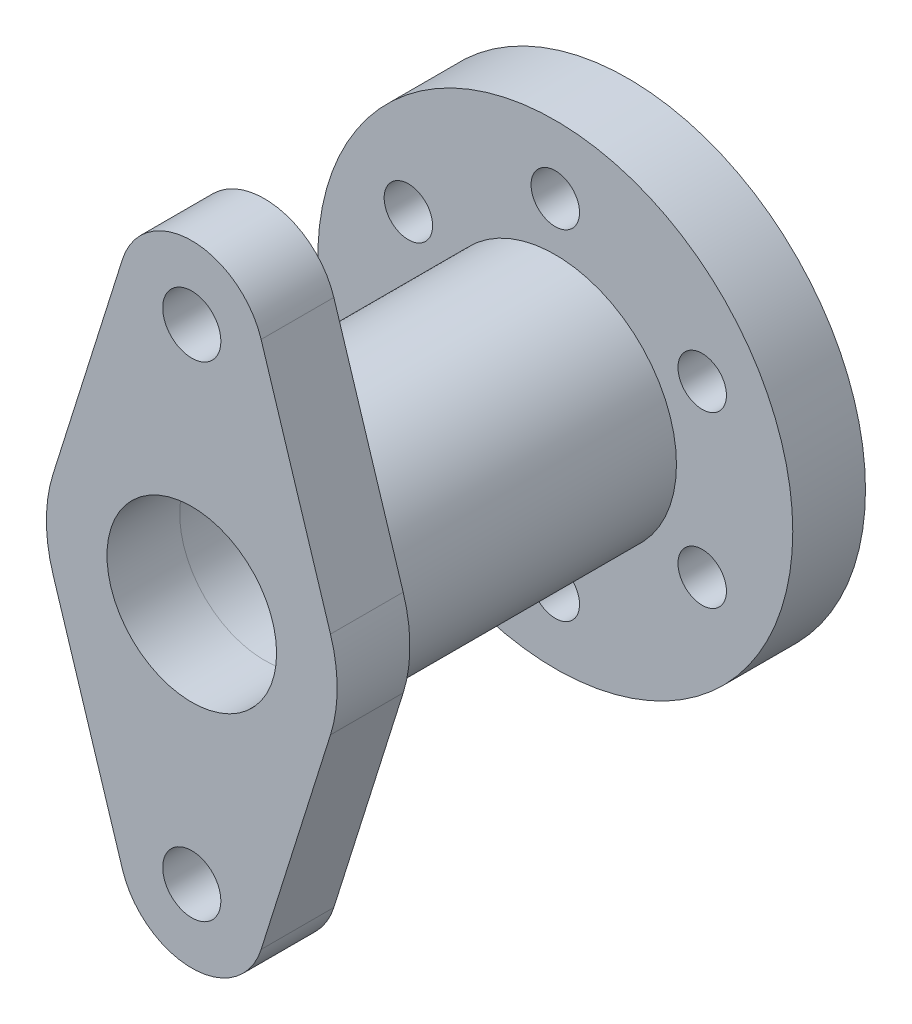
ISO-10303-21;
HEADER;
FILE_DESCRIPTION(('STEP AP214'),'2;1');
FILE_NAME('part.step','',(''),(''),'','','');
FILE_SCHEMA(('AUTOMOTIVE_DESIGN { 1 0 10303 214 1 1 1 1 }'));
ENDSEC;
DATA;
#1=APPLICATION_CONTEXT('core data for automotive mechanical design processes');
#2=APPLICATION_PROTOCOL_DEFINITION('international standard','automotive_design',2000,#1);
#3=PRODUCT_CONTEXT('',#1,'mechanical');
#4=PRODUCT('Part','Part','',(#3));
#5=PRODUCT_RELATED_PRODUCT_CATEGORY('part','',(#4));
#6=PRODUCT_DEFINITION_FORMATION('','',#4);
#7=PRODUCT_DEFINITION_CONTEXT('part definition',#1,'design');
#8=PRODUCT_DEFINITION('design','',#6,#7);
#9=PRODUCT_DEFINITION_SHAPE('','',#8);
#10=(LENGTH_UNIT() NAMED_UNIT(*) SI_UNIT(.MILLI.,.METRE.));
#11=(NAMED_UNIT(*) PLANE_ANGLE_UNIT() SI_UNIT($,.RADIAN.));
#12=(NAMED_UNIT(*) SI_UNIT($,.STERADIAN.) SOLID_ANGLE_UNIT());
#13=UNCERTAINTY_MEASURE_WITH_UNIT(LENGTH_MEASURE(1.E-05),#10,'distance_accuracy_value','');
#14=(GEOMETRIC_REPRESENTATION_CONTEXT(3) GLOBAL_UNCERTAINTY_ASSIGNED_CONTEXT((#13)) GLOBAL_UNIT_ASSIGNED_CONTEXT((#10,
#11,#12)) REPRESENTATION_CONTEXT('',''));
#15=CARTESIAN_POINT('',(0.,0.,0.));
#16=DIRECTION('',(0.,0.,1.));
#17=DIRECTION('',(1.,0.,0.));
#18=AXIS2_PLACEMENT_3D('',#15,#16,#17);
#19=CARTESIAN_POINT('',(28.6181760425084,-9.,75.));
#20=DIRECTION('',(-0.953939201416946,0.3,0.));
#21=DIRECTION('',(-0.3,-0.953939201416946,0.));
#22=AXIS2_PLACEMENT_3D('',#19,#20,#21);
#23=PLANE('',#22);
#24=DIRECTION('',(0.3,0.953939201416946,0.));
#25=VECTOR('',#24,1.);
#26=CARTESIAN_POINT('',(28.6181760425084,-9.,60.));
#27=LINE('',#26,#25);
#28=CARTESIAN_POINT('',(14.3090880212542,-54.5,60.));
#29=VERTEX_POINT('',#28);
#30=CARTESIAN_POINT('',(28.6181760425084,-8.99999999999999,60.));
#31=VERTEX_POINT('',#30);
#32=EDGE_CURVE('E144',#29,#31,#27,.T.);
#33=ORIENTED_EDGE('',*,*,#32,.T.);
#34=DIRECTION('',(0.,0.,-1.));
#35=VECTOR('',#34,1.);
#36=CARTESIAN_POINT('',(28.6181760425084,-8.99999999999999,75.));
#37=LINE('',#36,#35);
#38=CARTESIAN_POINT('',(28.6181760425084,-8.99999999999999,75.));
#39=VERTEX_POINT('',#38);
#40=EDGE_CURVE('E12',#39,#31,#37,.T.);
#41=ORIENTED_EDGE('',*,*,#40,.F.);
#42=DIRECTION('',(0.3,0.953939201416946,0.));
#43=VECTOR('',#42,1.);
#44=CARTESIAN_POINT('',(28.6181760425084,-9.,75.));
#45=LINE('',#44,#43);
#46=CARTESIAN_POINT('',(14.3090880212542,-54.5,75.));
#47=VERTEX_POINT('',#46);
#48=EDGE_CURVE('E167',#47,#39,#45,.T.);
#49=ORIENTED_EDGE('',*,*,#48,.F.);
#50=DIRECTION('',(0.,0.,-1.));
#51=VECTOR('',#50,1.);
#52=CARTESIAN_POINT('',(14.3090880212542,-54.5,75.));
#53=LINE('',#52,#51);
#54=EDGE_CURVE('E143',#47,#29,#53,.T.);
#55=ORIENTED_EDGE('',*,*,#54,.T.);
#56=EDGE_LOOP('',(#33,#41,#49,#55));
#57=FACE_BOUND('',#56,.T.);
#58=ADVANCED_FACE('F41',(#57),#23,.F.);
#59=CARTESIAN_POINT('',(0.,0.,75.));
#60=DIRECTION('',(0.,0.,-1.));
#61=DIRECTION('',(-1.,0.,0.));
#62=AXIS2_PLACEMENT_3D('',#59,#60,#61);
#63=CYLINDRICAL_SURFACE('',#62,30.);
#64=CARTESIAN_POINT('',(0.,0.,60.));
#65=DIRECTION('',(0.,0.,1.));
#66=DIRECTION('',(1.,0.,0.));
#67=AXIS2_PLACEMENT_3D('',#64,#65,#66);
#68=CIRCLE('',#67,30.);
#69=CARTESIAN_POINT('',(28.6181760425084,8.99999999999999,60.));
#70=VERTEX_POINT('',#69);
#71=EDGE_CURVE('E147',#31,#70,#68,.T.);
#72=ORIENTED_EDGE('',*,*,#71,.T.);
#73=DIRECTION('',(0.,0.,-1.));
#74=VECTOR('',#73,1.);
#75=CARTESIAN_POINT('',(28.6181760425084,8.99999999999999,75.));
#76=LINE('',#75,#74);
#77=CARTESIAN_POINT('',(28.6181760425084,8.99999999999999,75.));
#78=VERTEX_POINT('',#77);
#79=EDGE_CURVE('E50',#78,#70,#76,.T.);
#80=ORIENTED_EDGE('',*,*,#79,.F.);
#81=CARTESIAN_POINT('',(0.,0.,75.));
#82=DIRECTION('',(0.,0.,1.));
#83=DIRECTION('',(1.,0.,0.));
#84=AXIS2_PLACEMENT_3D('',#81,#82,#83);
#85=CIRCLE('',#84,30.);
#86=EDGE_CURVE('E97',#39,#78,#85,.T.);
#87=ORIENTED_EDGE('',*,*,#86,.F.);
#88=ORIENTED_EDGE('',*,*,#40,.T.);
#89=EDGE_LOOP('',(#72,#80,#87,#88));
#90=FACE_BOUND('',#89,.T.);
#91=ADVANCED_FACE('F182',(#90),#63,.T.);
#92=CARTESIAN_POINT('',(28.6181760425084,9.,75.));
#93=DIRECTION('',(0.953939201416946,0.3,0.));
#94=DIRECTION('',(-0.3,0.953939201416946,0.));
#95=AXIS2_PLACEMENT_3D('',#92,#93,#94);
#96=PLANE('',#95);
#97=DIRECTION('',(0.3,-0.953939201416946,0.));
#98=VECTOR('',#97,1.);
#99=CARTESIAN_POINT('',(28.6181760425084,9.,60.));
#100=LINE('',#99,#98);
#101=CARTESIAN_POINT('',(14.3090880212542,54.5,60.));
#102=VERTEX_POINT('',#101);
#103=EDGE_CURVE('E150',#102,#70,#100,.T.);
#104=ORIENTED_EDGE('',*,*,#103,.F.);
#105=DIRECTION('',(0.,0.,-1.));
#106=VECTOR('',#105,1.);
#107=CARTESIAN_POINT('',(14.3090880212542,54.5,75.));
#108=LINE('',#107,#106);
#109=CARTESIAN_POINT('',(14.3090880212542,54.5,75.));
#110=VERTEX_POINT('',#109);
#111=EDGE_CURVE('E174',#110,#102,#108,.T.);
#112=ORIENTED_EDGE('',*,*,#111,.F.);
#113=DIRECTION('',(0.3,-0.953939201416946,0.));
#114=VECTOR('',#113,1.);
#115=CARTESIAN_POINT('',(28.6181760425084,9.,75.));
#116=LINE('',#115,#114);
#117=EDGE_CURVE('E181',#110,#78,#116,.T.);
#118=ORIENTED_EDGE('',*,*,#117,.T.);
#119=ORIENTED_EDGE('',*,*,#79,.T.);
#120=EDGE_LOOP('',(#104,#112,#118,#119));
#121=FACE_BOUND('',#120,.T.);
#122=ADVANCED_FACE('F179',(#121),#96,.T.);
#123=CARTESIAN_POINT('',(0.,50.,75.));
#124=DIRECTION('',(0.,0.,-1.));
#125=DIRECTION('',(-1.,0.,0.));
#126=AXIS2_PLACEMENT_3D('',#123,#124,#125);
#127=CYLINDRICAL_SURFACE('',#126,15.);
#128=CARTESIAN_POINT('',(0.,50.,60.));
#129=DIRECTION('',(0.,0.,1.));
#130=DIRECTION('',(1.,0.,0.));
#131=AXIS2_PLACEMENT_3D('',#128,#129,#130);
#132=CIRCLE('',#131,15.);
#133=CARTESIAN_POINT('',(-14.3090880212542,54.5,60.));
#134=VERTEX_POINT('',#133);
#135=EDGE_CURVE('E153',#102,#134,#132,.T.);
#136=ORIENTED_EDGE('',*,*,#135,.T.);
#137=DIRECTION('',(0.,0.,-1.));
#138=VECTOR('',#137,1.);
#139=CARTESIAN_POINT('',(-14.3090880212542,54.5,75.));
#140=LINE('',#139,#138);
#141=CARTESIAN_POINT('',(-14.3090880212542,54.5,75.));
#142=VERTEX_POINT('',#141);
#143=EDGE_CURVE('E171',#142,#134,#140,.T.);
#144=ORIENTED_EDGE('',*,*,#143,.F.);
#145=CARTESIAN_POINT('',(0.,50.,75.));
#146=DIRECTION('',(0.,0.,1.));
#147=DIRECTION('',(1.,0.,0.));
#148=AXIS2_PLACEMENT_3D('',#145,#146,#147);
#149=CIRCLE('',#148,15.);
#150=EDGE_CURVE('E196',#110,#142,#149,.T.);
#151=ORIENTED_EDGE('',*,*,#150,.F.);
#152=ORIENTED_EDGE('',*,*,#111,.T.);
#153=EDGE_LOOP('',(#136,#144,#151,#152));
#154=FACE_BOUND('',#153,.T.);
#155=ADVANCED_FACE('F192',(#154),#127,.T.);
#156=CARTESIAN_POINT('',(-28.6181760425084,9.,75.));
#157=DIRECTION('',(0.953939201416946,-0.3,0.));
#158=DIRECTION('',(0.3,0.953939201416946,0.));
#159=AXIS2_PLACEMENT_3D('',#156,#157,#158);
#160=PLANE('',#159);
#161=DIRECTION('',(-0.3,-0.953939201416946,0.));
#162=VECTOR('',#161,1.);
#163=CARTESIAN_POINT('',(-28.6181760425084,9.,60.));
#164=LINE('',#163,#162);
#165=CARTESIAN_POINT('',(-28.6181760425084,9.,60.));
#166=VERTEX_POINT('',#165);
#167=EDGE_CURVE('E155',#134,#166,#164,.T.);
#168=ORIENTED_EDGE('',*,*,#167,.T.);
#169=DIRECTION('',(0.,0.,-1.));
#170=VECTOR('',#169,1.);
#171=CARTESIAN_POINT('',(-28.6181760425084,9.,75.));
#172=LINE('',#171,#170);
#173=CARTESIAN_POINT('',(-28.6181760425084,9.,75.));
#174=VERTEX_POINT('',#173);
#175=EDGE_CURVE('E130',#174,#166,#172,.T.);
#176=ORIENTED_EDGE('',*,*,#175,.F.);
#177=DIRECTION('',(-0.3,-0.953939201416946,0.));
#178=VECTOR('',#177,1.);
#179=CARTESIAN_POINT('',(-28.6181760425084,9.,75.));
#180=LINE('',#179,#178);
#181=EDGE_CURVE('E117',#142,#174,#180,.T.);
#182=ORIENTED_EDGE('',*,*,#181,.F.);
#183=ORIENTED_EDGE('',*,*,#143,.T.);
#184=EDGE_LOOP('',(#168,#176,#182,#183));
#185=FACE_BOUND('',#184,.T.);
#186=ADVANCED_FACE('F195',(#185),#160,.F.);
#187=CARTESIAN_POINT('',(0.,0.,75.));
#188=DIRECTION('',(0.,0.,-1.));
#189=DIRECTION('',(-1.,0.,0.));
#190=AXIS2_PLACEMENT_3D('',#187,#188,#189);
#191=CYLINDRICAL_SURFACE('',#190,30.);
#192=CARTESIAN_POINT('',(0.,0.,60.));
#193=DIRECTION('',(0.,0.,1.));
#194=DIRECTION('',(1.,0.,0.));
#195=AXIS2_PLACEMENT_3D('',#192,#193,#194);
#196=CIRCLE('',#195,30.);
#197=CARTESIAN_POINT('',(-28.6181760425084,-9.,60.));
#198=VERTEX_POINT('',#197);
#199=EDGE_CURVE('E126',#166,#198,#196,.T.);
#200=ORIENTED_EDGE('',*,*,#199,.T.);
#201=DIRECTION('',(0.,0.,-1.));
#202=VECTOR('',#201,1.);
#203=CARTESIAN_POINT('',(-28.6181760425084,-9.,75.));
#204=LINE('',#203,#202);
#205=CARTESIAN_POINT('',(-28.6181760425084,-9.,75.));
#206=VERTEX_POINT('',#205);
#207=EDGE_CURVE('E123',#206,#198,#204,.T.);
#208=ORIENTED_EDGE('',*,*,#207,.F.);
#209=CARTESIAN_POINT('',(0.,0.,75.));
#210=DIRECTION('',(0.,0.,1.));
#211=DIRECTION('',(1.,0.,0.));
#212=AXIS2_PLACEMENT_3D('',#209,#210,#211);
#213=CIRCLE('',#212,30.);
#214=EDGE_CURVE('E110',#174,#206,#213,.T.);
#215=ORIENTED_EDGE('',*,*,#214,.F.);
#216=ORIENTED_EDGE('',*,*,#175,.T.);
#217=EDGE_LOOP('',(#200,#208,#215,#216));
#218=FACE_BOUND('',#217,.T.);
#219=ADVANCED_FACE('F124',(#218),#191,.T.);
#220=CARTESIAN_POINT('',(-28.6181760425084,-9.,75.));
#221=DIRECTION('',(-0.953939201416946,-0.3,0.));
#222=DIRECTION('',(0.3,-0.953939201416946,0.));
#223=AXIS2_PLACEMENT_3D('',#220,#221,#222);
#224=PLANE('',#223);
#225=DIRECTION('',(-0.3,0.953939201416946,0.));
#226=VECTOR('',#225,1.);
#227=CARTESIAN_POINT('',(-28.6181760425084,-9.,60.));
#228=LINE('',#227,#226);
#229=CARTESIAN_POINT('',(-14.3090880212542,-54.5,60.));
#230=VERTEX_POINT('',#229);
#231=EDGE_CURVE('E158',#230,#198,#228,.T.);
#232=ORIENTED_EDGE('',*,*,#231,.F.);
#233=DIRECTION('',(0.,0.,-1.));
#234=VECTOR('',#233,1.);
#235=CARTESIAN_POINT('',(-14.3090880212542,-54.5,75.));
#236=LINE('',#235,#234);
#237=CARTESIAN_POINT('',(-14.3090880212542,-54.5,75.));
#238=VERTEX_POINT('',#237);
#239=EDGE_CURVE('E86',#238,#230,#236,.T.);
#240=ORIENTED_EDGE('',*,*,#239,.F.);
#241=DIRECTION('',(-0.3,0.953939201416946,0.));
#242=VECTOR('',#241,1.);
#243=CARTESIAN_POINT('',(-28.6181760425084,-9.,75.));
#244=LINE('',#243,#242);
#245=EDGE_CURVE('E115',#238,#206,#244,.T.);
#246=ORIENTED_EDGE('',*,*,#245,.T.);
#247=ORIENTED_EDGE('',*,*,#207,.T.);
#248=EDGE_LOOP('',(#232,#240,#246,#247));
#249=FACE_BOUND('',#248,.T.);
#250=ADVANCED_FACE('F132',(#249),#224,.T.);
#251=CARTESIAN_POINT('',(0.,-50.,75.));
#252=DIRECTION('',(0.,0.,-1.));
#253=DIRECTION('',(-1.,0.,0.));
#254=AXIS2_PLACEMENT_3D('',#251,#252,#253);
#255=CYLINDRICAL_SURFACE('',#254,6.);
#256=CARTESIAN_POINT('',(0.,-50.,75.));
#257=DIRECTION('',(0.,0.,1.));
#258=DIRECTION('',(1.,0.,0.));
#259=AXIS2_PLACEMENT_3D('',#256,#257,#258);
#260=CIRCLE('',#259,6.);
#261=CARTESIAN_POINT('',(6.,-50.,75.));
#262=VERTEX_POINT('',#261);
#263=EDGE_CURVE('E134',#262,#262,#260,.T.);
#264=ORIENTED_EDGE('',*,*,#263,.T.);
#265=EDGE_LOOP('',(#264));
#266=FACE_BOUND('',#265,.T.);
#267=CARTESIAN_POINT('',(0.,-50.,60.));
#268=DIRECTION('',(0.,0.,1.));
#269=DIRECTION('',(1.,0.,0.));
#270=AXIS2_PLACEMENT_3D('',#267,#268,#269);
#271=CIRCLE('',#270,6.);
#272=CARTESIAN_POINT('',(6.,-50.,60.));
#273=VERTEX_POINT('',#272);
#274=EDGE_CURVE('E161',#273,#273,#271,.T.);
#275=ORIENTED_EDGE('',*,*,#274,.F.);
#276=EDGE_LOOP('',(#275));
#277=FACE_BOUND('',#276,.T.);
#278=ADVANCED_FACE('F227',(#266,#277),#255,.F.);
#279=CARTESIAN_POINT('',(0.,-50.,75.));
#280=DIRECTION('',(0.,0.,-1.));
#281=DIRECTION('',(-1.,0.,0.));
#282=AXIS2_PLACEMENT_3D('',#279,#280,#281);
#283=CYLINDRICAL_SURFACE('',#282,15.);
#284=CARTESIAN_POINT('',(0.,-50.,60.));
#285=DIRECTION('',(0.,0.,1.));
#286=DIRECTION('',(1.,0.,0.));
#287=AXIS2_PLACEMENT_3D('',#284,#285,#286);
#288=CIRCLE('',#287,15.);
#289=EDGE_CURVE('E89',#230,#29,#288,.T.);
#290=ORIENTED_EDGE('',*,*,#289,.T.);
#291=ORIENTED_EDGE('',*,*,#54,.F.);
#292=CARTESIAN_POINT('',(0.,-50.,75.));
#293=DIRECTION('',(0.,0.,1.));
#294=DIRECTION('',(1.,0.,0.));
#295=AXIS2_PLACEMENT_3D('',#292,#293,#294);
#296=CIRCLE('',#295,15.);
#297=EDGE_CURVE('E58',#238,#47,#296,.T.);
#298=ORIENTED_EDGE('',*,*,#297,.F.);
#299=ORIENTED_EDGE('',*,*,#239,.T.);
#300=EDGE_LOOP('',(#290,#291,#298,#299));
#301=FACE_BOUND('',#300,.T.);
#302=ADVANCED_FACE('F224',(#301),#283,.T.);
#303=CARTESIAN_POINT('',(0.,50.,75.));
#304=DIRECTION('',(0.,0.,-1.));
#305=DIRECTION('',(-1.,0.,0.));
#306=AXIS2_PLACEMENT_3D('',#303,#304,#305);
#307=CYLINDRICAL_SURFACE('',#306,6.);
#308=CARTESIAN_POINT('',(0.,50.,75.));
#309=DIRECTION('',(0.,0.,1.));
#310=DIRECTION('',(1.,0.,0.));
#311=AXIS2_PLACEMENT_3D('',#308,#309,#310);
#312=CIRCLE('',#311,6.);
#313=CARTESIAN_POINT('',(6.,50.,75.));
#314=VERTEX_POINT('',#313);
#315=EDGE_CURVE('E140',#314,#314,#312,.T.);
#316=ORIENTED_EDGE('',*,*,#315,.T.);
#317=EDGE_LOOP('',(#316));
#318=FACE_BOUND('',#317,.T.);
#319=CARTESIAN_POINT('',(0.,50.,60.));
#320=DIRECTION('',(0.,0.,1.));
#321=DIRECTION('',(1.,0.,0.));
#322=AXIS2_PLACEMENT_3D('',#319,#320,#321);
#323=CIRCLE('',#322,6.);
#324=CARTESIAN_POINT('',(6.,50.,60.));
#325=VERTEX_POINT('',#324);
#326=EDGE_CURVE('E164',#325,#325,#323,.T.);
#327=ORIENTED_EDGE('',*,*,#326,.F.);
#328=EDGE_LOOP('',(#327));
#329=FACE_BOUND('',#328,.T.);
#330=ADVANCED_FACE('F226',(#318,#329),#307,.F.);
#331=CARTESIAN_POINT('',(0.,0.,75.));
#332=DIRECTION('',(0.,0.,1.));
#333=DIRECTION('',(1.,0.,0.));
#334=AXIS2_PLACEMENT_3D('',#331,#332,#333);
#335=PLANE('',#334);
#336=CARTESIAN_POINT('',(0.,0.,75.));
#337=DIRECTION('',(0.,0.,1.));
#338=DIRECTION('',(1.,0.,0.));
#339=AXIS2_PLACEMENT_3D('',#336,#337,#338);
#340=CIRCLE('',#339,17.5);
#341=CARTESIAN_POINT('',(17.5,0.,75.));
#342=VERTEX_POINT('',#341);
#343=EDGE_CURVE('E202',#342,#342,#340,.T.);
#344=ORIENTED_EDGE('',*,*,#343,.F.);
#345=EDGE_LOOP('',(#344));
#346=FACE_BOUND('',#345,.T.);
#347=ORIENTED_EDGE('',*,*,#48,.T.);
#348=ORIENTED_EDGE('',*,*,#86,.T.);
#349=ORIENTED_EDGE('',*,*,#117,.F.);
#350=ORIENTED_EDGE('',*,*,#150,.T.);
#351=ORIENTED_EDGE('',*,*,#181,.T.);
#352=ORIENTED_EDGE('',*,*,#214,.T.);
#353=ORIENTED_EDGE('',*,*,#245,.F.);
#354=ORIENTED_EDGE('',*,*,#297,.T.);
#355=EDGE_LOOP('',(#347,#348,#349,#350,#351,#352,#353,#354));
#356=FACE_BOUND('',#355,.T.);
#357=ORIENTED_EDGE('',*,*,#263,.F.);
#358=EDGE_LOOP('',(#357));
#359=FACE_BOUND('',#358,.T.);
#360=ORIENTED_EDGE('',*,*,#315,.F.);
#361=EDGE_LOOP('',(#360));
#362=FACE_BOUND('',#361,.T.);
#363=ADVANCED_FACE('F112',(#346,#356,#359,#362),#335,.T.);
#364=CARTESIAN_POINT('',(0.,0.,60.));
#365=DIRECTION('',(0.,0.,1.));
#366=DIRECTION('',(1.,0.,0.));
#367=AXIS2_PLACEMENT_3D('',#364,#365,#366);
#368=PLANE('',#367);
#369=CARTESIAN_POINT('',(0.,0.,60.));
#370=DIRECTION('',(0.,0.,1.));
#371=DIRECTION('',(1.,0.,0.));
#372=AXIS2_PLACEMENT_3D('',#369,#370,#371);
#373=CIRCLE('',#372,17.5);
#374=CARTESIAN_POINT('',(17.5,0.,60.));
#375=VERTEX_POINT('',#374);
#376=EDGE_CURVE('E44',#375,#375,#373,.T.);
#377=ORIENTED_EDGE('',*,*,#376,.T.);
#378=EDGE_LOOP('',(#377));
#379=FACE_BOUND('',#378,.T.);
#380=ORIENTED_EDGE('',*,*,#32,.F.);
#381=ORIENTED_EDGE('',*,*,#289,.F.);
#382=ORIENTED_EDGE('',*,*,#231,.T.);
#383=ORIENTED_EDGE('',*,*,#199,.F.);
#384=ORIENTED_EDGE('',*,*,#167,.F.);
#385=ORIENTED_EDGE('',*,*,#135,.F.);
#386=ORIENTED_EDGE('',*,*,#103,.T.);
#387=ORIENTED_EDGE('',*,*,#71,.F.);
#388=EDGE_LOOP('',(#380,#381,#382,#383,#384,#385,#386,#387));
#389=FACE_BOUND('',#388,.T.);
#390=ORIENTED_EDGE('',*,*,#274,.T.);
#391=EDGE_LOOP('',(#390));
#392=FACE_BOUND('',#391,.T.);
#393=ORIENTED_EDGE('',*,*,#326,.T.);
#394=EDGE_LOOP('',(#393));
#395=FACE_BOUND('',#394,.T.);
#396=ADVANCED_FACE('F187',(#379,#389,#392,#395),#368,.F.);
#397=CARTESIAN_POINT('',(0.,0.,45.));
#398=DIRECTION('',(0.,0.,1.));
#399=DIRECTION('',(1.,0.,0.));
#400=AXIS2_PLACEMENT_3D('',#397,#398,#399);
#401=CYLINDRICAL_SURFACE('',#400,17.5);
#402=ORIENTED_EDGE('',*,*,#343,.T.);
#403=EDGE_LOOP('',(#402));
#404=FACE_BOUND('',#403,.T.);
#405=ORIENTED_EDGE('',*,*,#376,.F.);
#406=EDGE_LOOP('',(#405));
#407=FACE_BOUND('',#406,.T.);
#408=ADVANCED_FACE('F210',(#404,#407),#401,.F.);
#409=CLOSED_SHELL('',(#58,#91,#122,#155,#186,#219,#250,#278,#302,#330,#363,#396,#408));
#410=MANIFOLD_SOLID_BREP('B2',#409);
#411=CARTESIAN_POINT('',(0.,35.,-15.));
#412=DIRECTION('',(0.,0.,1.));
#413=DIRECTION('',(1.,0.,0.));
#414=AXIS2_PLACEMENT_3D('',#411,#412,#413);
#415=CYLINDRICAL_SURFACE('',#414,5.);
#416=CARTESIAN_POINT('',(0.,35.,-15.));
#417=DIRECTION('',(0.,0.,1.));
#418=DIRECTION('',(1.,0.,0.));
#419=AXIS2_PLACEMENT_3D('',#416,#417,#418);
#420=CIRCLE('',#419,5.);
#421=CARTESIAN_POINT('',(5.,35.,-15.));
#422=VERTEX_POINT('',#421);
#423=EDGE_CURVE('E352',#422,#422,#420,.T.);
#424=ORIENTED_EDGE('',*,*,#423,.F.);
#425=EDGE_LOOP('',(#424));
#426=FACE_BOUND('',#425,.T.);
#427=CARTESIAN_POINT('',(0.,35.,0.));
#428=DIRECTION('',(0.,0.,1.));
#429=DIRECTION('',(1.,0.,0.));
#430=AXIS2_PLACEMENT_3D('',#427,#428,#429);
#431=CIRCLE('',#430,5.);
#432=CARTESIAN_POINT('',(5.,35.,0.));
#433=VERTEX_POINT('',#432);
#434=EDGE_CURVE('E377',#433,#433,#431,.T.);
#435=ORIENTED_EDGE('',*,*,#434,.T.);
#436=EDGE_LOOP('',(#435));
#437=FACE_BOUND('',#436,.T.);
#438=ADVANCED_FACE('F344',(#426,#437),#415,.F.);
#439=CARTESIAN_POINT('',(30.3108891324563,17.5000000000017,-15.));
#440=DIRECTION('',(0.,0.,1.));
#441=DIRECTION('',(1.,0.,0.));
#442=AXIS2_PLACEMENT_3D('',#439,#440,#441);
#443=CYLINDRICAL_SURFACE('',#442,5.00000000000052);
#444=CARTESIAN_POINT('',(30.3108891324563,17.5000000000017,-15.));
#445=DIRECTION('',(0.,0.,1.));
#446=DIRECTION('',(1.,0.,0.));
#447=AXIS2_PLACEMENT_3D('',#444,#445,#446);
#448=CIRCLE('',#447,5.00000000000052);
#449=CARTESIAN_POINT('',(35.3108891324569,17.5000000000017,-15.));
#450=VERTEX_POINT('',#449);
#451=EDGE_CURVE('E357',#450,#450,#448,.T.);
#452=ORIENTED_EDGE('',*,*,#451,.F.);
#453=EDGE_LOOP('',(#452));
#454=FACE_BOUND('',#453,.T.);
#455=CARTESIAN_POINT('',(30.3108891324563,17.5000000000017,0.));
#456=DIRECTION('',(0.,0.,1.));
#457=DIRECTION('',(1.,0.,0.));
#458=AXIS2_PLACEMENT_3D('',#455,#456,#457);
#459=CIRCLE('',#458,5.00000000000052);
#460=CARTESIAN_POINT('',(35.3108891324569,17.5000000000017,0.));
#461=VERTEX_POINT('',#460);
#462=EDGE_CURVE('E374',#461,#461,#459,.T.);
#463=ORIENTED_EDGE('',*,*,#462,.T.);
#464=EDGE_LOOP('',(#463));
#465=FACE_BOUND('',#464,.T.);
#466=ADVANCED_FACE('F406',(#454,#465),#443,.F.);
#467=CARTESIAN_POINT('',(30.3108891324583,-17.4999999999983,-15.));
#468=DIRECTION('',(0.,0.,1.));
#469=DIRECTION('',(1.,0.,0.));
#470=AXIS2_PLACEMENT_3D('',#467,#468,#469);
#471=CYLINDRICAL_SURFACE('',#470,5.00000000000251);
#472=CARTESIAN_POINT('',(30.3108891324583,-17.4999999999983,-15.));
#473=DIRECTION('',(0.,0.,1.));
#474=DIRECTION('',(1.,0.,0.));
#475=AXIS2_PLACEMENT_3D('',#472,#473,#474);
#476=CIRCLE('',#475,5.00000000000251);
#477=CARTESIAN_POINT('',(35.3108891324608,-17.4999999999983,-15.));
#478=VERTEX_POINT('',#477);
#479=EDGE_CURVE('E398',#478,#478,#476,.T.);
#480=ORIENTED_EDGE('',*,*,#479,.F.);
#481=EDGE_LOOP('',(#480));
#482=FACE_BOUND('',#481,.T.);
#483=CARTESIAN_POINT('',(30.3108891324583,-17.4999999999983,0.));
#484=DIRECTION('',(0.,0.,1.));
#485=DIRECTION('',(1.,0.,0.));
#486=AXIS2_PLACEMENT_3D('',#483,#484,#485);
#487=CIRCLE('',#486,5.00000000000251);
#488=CARTESIAN_POINT('',(35.3108891324608,-17.4999999999983,0.));
#489=VERTEX_POINT('',#488);
#490=EDGE_CURVE('E371',#489,#489,#487,.T.);
#491=ORIENTED_EDGE('',*,*,#490,.T.);
#492=EDGE_LOOP('',(#491));
#493=FACE_BOUND('',#492,.T.);
#494=ADVANCED_FACE('F409',(#482,#493),#471,.F.);
#495=CARTESIAN_POINT('',(3.97046679266253E-12,-35.,-15.));
#496=DIRECTION('',(0.,0.,1.));
#497=DIRECTION('',(1.,0.,0.));
#498=AXIS2_PLACEMENT_3D('',#495,#496,#497);
#499=CYLINDRICAL_SURFACE('',#498,5.00000000000403);
#500=CARTESIAN_POINT('',(3.97046679266253E-12,-35.,-15.));
#501=DIRECTION('',(0.,0.,1.));
#502=DIRECTION('',(1.,0.,0.));
#503=AXIS2_PLACEMENT_3D('',#500,#501,#502);
#504=CIRCLE('',#503,5.00000000000403);
#505=CARTESIAN_POINT('',(5.000000000008,-35.,-15.));
#506=VERTEX_POINT('',#505);
#507=EDGE_CURVE('E390',#506,#506,#504,.T.);
#508=ORIENTED_EDGE('',*,*,#507,.F.);
#509=EDGE_LOOP('',(#508));
#510=FACE_BOUND('',#509,.T.);
#511=CARTESIAN_POINT('',(3.97046679266253E-12,-35.,0.));
#512=DIRECTION('',(0.,0.,1.));
#513=DIRECTION('',(1.,0.,0.));
#514=AXIS2_PLACEMENT_3D('',#511,#512,#513);
#515=CIRCLE('',#514,5.00000000000403);
#516=CARTESIAN_POINT('',(5.000000000008,-35.,0.));
#517=VERTEX_POINT('',#516);
#518=EDGE_CURVE('E368',#517,#517,#515,.T.);
#519=ORIENTED_EDGE('',*,*,#518,.T.);
#520=EDGE_LOOP('',(#519));
#521=FACE_BOUND('',#520,.T.);
#522=ADVANCED_FACE('F432',(#510,#521),#499,.F.);
#523=CARTESIAN_POINT('',(-30.3108891324524,-17.5000000000017,-15.));
#524=DIRECTION('',(0.,0.,1.));
#525=DIRECTION('',(1.,0.,0.));
#526=AXIS2_PLACEMENT_3D('',#523,#524,#525);
#527=CYLINDRICAL_SURFACE('',#526,5.00000000000367);
#528=CARTESIAN_POINT('',(-30.3108891324524,-17.5000000000017,-15.));
#529=DIRECTION('',(0.,0.,1.));
#530=DIRECTION('',(1.,0.,0.));
#531=AXIS2_PLACEMENT_3D('',#528,#529,#530);
#532=CIRCLE('',#531,5.00000000000367);
#533=CARTESIAN_POINT('',(-25.3108891324487,-17.5000000000017,-15.));
#534=VERTEX_POINT('',#533);
#535=EDGE_CURVE('E385',#534,#534,#532,.T.);
#536=ORIENTED_EDGE('',*,*,#535,.F.);
#537=EDGE_LOOP('',(#536));
#538=FACE_BOUND('',#537,.T.);
#539=CARTESIAN_POINT('',(-30.3108891324524,-17.5000000000017,0.));
#540=DIRECTION('',(0.,0.,1.));
#541=DIRECTION('',(1.,0.,0.));
#542=AXIS2_PLACEMENT_3D('',#539,#540,#541);
#543=CIRCLE('',#542,5.00000000000367);
#544=CARTESIAN_POINT('',(-25.3108891324487,-17.5000000000017,0.));
#545=VERTEX_POINT('',#544);
#546=EDGE_CURVE('E364',#545,#545,#543,.T.);
#547=ORIENTED_EDGE('',*,*,#546,.T.);
#548=EDGE_LOOP('',(#547));
#549=FACE_BOUND('',#548,.T.);
#550=ADVANCED_FACE('F435',(#538,#549),#527,.F.);
#551=CARTESIAN_POINT('',(-30.3108891324544,17.4999999999983,-15.));
#552=DIRECTION('',(0.,0.,1.));
#553=DIRECTION('',(1.,0.,0.));
#554=AXIS2_PLACEMENT_3D('',#551,#552,#553);
#555=CYLINDRICAL_SURFACE('',#554,5.00000000000187);
#556=CARTESIAN_POINT('',(-30.3108891324544,17.4999999999983,-15.));
#557=DIRECTION('',(0.,0.,1.));
#558=DIRECTION('',(1.,0.,0.));
#559=AXIS2_PLACEMENT_3D('',#556,#557,#558);
#560=CIRCLE('',#559,5.00000000000187);
#561=CARTESIAN_POINT('',(-25.3108891324525,17.4999999999983,-15.));
#562=VERTEX_POINT('',#561);
#563=EDGE_CURVE('E381',#562,#562,#560,.T.);
#564=ORIENTED_EDGE('',*,*,#563,.F.);
#565=EDGE_LOOP('',(#564));
#566=FACE_BOUND('',#565,.T.);
#567=CARTESIAN_POINT('',(-30.3108891324544,17.4999999999983,0.));
#568=DIRECTION('',(0.,0.,1.));
#569=DIRECTION('',(1.,0.,0.));
#570=AXIS2_PLACEMENT_3D('',#567,#568,#569);
#571=CIRCLE('',#570,5.00000000000187);
#572=CARTESIAN_POINT('',(-25.3108891324525,17.4999999999983,0.));
#573=VERTEX_POINT('',#572);
#574=EDGE_CURVE('E361',#573,#573,#571,.T.);
#575=ORIENTED_EDGE('',*,*,#574,.T.);
#576=EDGE_LOOP('',(#575));
#577=FACE_BOUND('',#576,.T.);
#578=ADVANCED_FACE('F346',(#566,#577),#555,.F.);
#579=CARTESIAN_POINT('',(0.,0.,-15.));
#580=DIRECTION('',(0.,0.,1.));
#581=DIRECTION('',(1.,0.,0.));
#582=AXIS2_PLACEMENT_3D('',#579,#580,#581);
#583=CYLINDRICAL_SURFACE('',#582,49.);
#584=CARTESIAN_POINT('',(0.,0.,-15.));
#585=DIRECTION('',(0.,0.,1.));
#586=DIRECTION('',(1.,0.,0.));
#587=AXIS2_PLACEMENT_3D('',#584,#585,#586);
#588=CIRCLE('',#587,49.);
#589=CARTESIAN_POINT('',(49.,0.,-15.));
#590=VERTEX_POINT('',#589);
#591=EDGE_CURVE('E40',#590,#590,#588,.T.);
#592=ORIENTED_EDGE('',*,*,#591,.T.);
#593=EDGE_LOOP('',(#592));
#594=FACE_BOUND('',#593,.T.);
#595=CARTESIAN_POINT('',(0.,0.,0.));
#596=DIRECTION('',(0.,0.,1.));
#597=DIRECTION('',(1.,0.,0.));
#598=AXIS2_PLACEMENT_3D('',#595,#596,#597);
#599=CIRCLE('',#598,49.);
#600=CARTESIAN_POINT('',(49.,0.,0.));
#601=VERTEX_POINT('',#600);
#602=EDGE_CURVE('E379',#601,#601,#599,.T.);
#603=ORIENTED_EDGE('',*,*,#602,.F.);
#604=EDGE_LOOP('',(#603));
#605=FACE_BOUND('',#604,.T.);
#606=ADVANCED_FACE('F428',(#594,#605),#583,.T.);
#607=CARTESIAN_POINT('',(0.,0.,-15.));
#608=DIRECTION('',(0.,0.,1.));
#609=DIRECTION('',(1.,0.,0.));
#610=AXIS2_PLACEMENT_3D('',#607,#608,#609);
#611=PLANE('',#610);
#612=CARTESIAN_POINT('',(0.,0.,-15.));
#613=DIRECTION('',(0.,0.,1.));
#614=DIRECTION('',(1.,0.,0.));
#615=AXIS2_PLACEMENT_3D('',#612,#613,#614);
#616=CIRCLE('',#615,14.);
#617=CARTESIAN_POINT('',(14.,0.,-15.));
#618=VERTEX_POINT('',#617);
#619=EDGE_CURVE('E490',#618,#618,#616,.T.);
#620=ORIENTED_EDGE('',*,*,#619,.T.);
#621=EDGE_LOOP('',(#620));
#622=FACE_BOUND('',#621,.T.);
#623=ORIENTED_EDGE('',*,*,#563,.T.);
#624=EDGE_LOOP('',(#623));
#625=FACE_BOUND('',#624,.T.);
#626=ORIENTED_EDGE('',*,*,#535,.T.);
#627=EDGE_LOOP('',(#626));
#628=FACE_BOUND('',#627,.T.);
#629=ORIENTED_EDGE('',*,*,#507,.T.);
#630=EDGE_LOOP('',(#629));
#631=FACE_BOUND('',#630,.T.);
#632=ORIENTED_EDGE('',*,*,#479,.T.);
#633=EDGE_LOOP('',(#632));
#634=FACE_BOUND('',#633,.T.);
#635=ORIENTED_EDGE('',*,*,#451,.T.);
#636=EDGE_LOOP('',(#635));
#637=FACE_BOUND('',#636,.T.);
#638=ORIENTED_EDGE('',*,*,#423,.T.);
#639=EDGE_LOOP('',(#638));
#640=FACE_BOUND('',#639,.T.);
#641=ORIENTED_EDGE('',*,*,#591,.F.);
#642=EDGE_LOOP('',(#641));
#643=FACE_BOUND('',#642,.T.);
#644=ADVANCED_FACE('F403',(#622,#625,#628,#631,#634,#637,#640,#643),#611,.F.);
#645=CARTESIAN_POINT('',(0.,0.,0.));
#646=DIRECTION('',(0.,0.,1.));
#647=DIRECTION('',(1.,0.,0.));
#648=AXIS2_PLACEMENT_3D('',#645,#646,#647);
#649=PLANE('',#648);
#650=CARTESIAN_POINT('',(0.,0.,0.));
#651=DIRECTION('',(0.,0.,1.));
#652=DIRECTION('',(1.,0.,0.));
#653=AXIS2_PLACEMENT_3D('',#650,#651,#652);
#654=CIRCLE('',#653,25.);
#655=CARTESIAN_POINT('',(25.,0.,0.));
#656=VERTEX_POINT('',#655);
#657=EDGE_CURVE('E393',#656,#656,#654,.T.);
#658=ORIENTED_EDGE('',*,*,#657,.F.);
#659=EDGE_LOOP('',(#658));
#660=FACE_BOUND('',#659,.T.);
#661=ORIENTED_EDGE('',*,*,#574,.F.);
#662=EDGE_LOOP('',(#661));
#663=FACE_BOUND('',#662,.T.);
#664=ORIENTED_EDGE('',*,*,#546,.F.);
#665=EDGE_LOOP('',(#664));
#666=FACE_BOUND('',#665,.T.);
#667=ORIENTED_EDGE('',*,*,#518,.F.);
#668=EDGE_LOOP('',(#667));
#669=FACE_BOUND('',#668,.T.);
#670=ORIENTED_EDGE('',*,*,#490,.F.);
#671=EDGE_LOOP('',(#670));
#672=FACE_BOUND('',#671,.T.);
#673=ORIENTED_EDGE('',*,*,#462,.F.);
#674=EDGE_LOOP('',(#673));
#675=FACE_BOUND('',#674,.T.);
#676=ORIENTED_EDGE('',*,*,#434,.F.);
#677=EDGE_LOOP('',(#676));
#678=FACE_BOUND('',#677,.T.);
#679=ORIENTED_EDGE('',*,*,#602,.T.);
#680=EDGE_LOOP('',(#679));
#681=FACE_BOUND('',#680,.T.);
#682=ADVANCED_FACE('F413',(#660,#663,#666,#669,#672,#675,#678,#681),#649,.T.);
#683=CARTESIAN_POINT('',(0.,0.,60.));
#684=DIRECTION('',(0.,0.,-1.));
#685=DIRECTION('',(-1.,0.,0.));
#686=AXIS2_PLACEMENT_3D('',#683,#684,#685);
#687=CYLINDRICAL_SURFACE('',#686,25.);
#688=CARTESIAN_POINT('',(0.,0.,60.));
#689=DIRECTION('',(0.,0.,1.));
#690=DIRECTION('',(1.,0.,0.));
#691=AXIS2_PLACEMENT_3D('',#688,#689,#690);
#692=CIRCLE('',#691,25.);
#693=CARTESIAN_POINT('',(25.,0.,60.));
#694=VERTEX_POINT('',#693);
#695=EDGE_CURVE('E365',#694,#694,#692,.T.);
#696=ORIENTED_EDGE('',*,*,#695,.F.);
#697=EDGE_LOOP('',(#696));
#698=FACE_BOUND('',#697,.T.);
#699=ORIENTED_EDGE('',*,*,#657,.T.);
#700=EDGE_LOOP('',(#699));
#701=FACE_BOUND('',#700,.T.);
#702=ADVANCED_FACE('F416',(#698,#701),#687,.T.);
#703=CARTESIAN_POINT('',(0.,0.,60.));
#704=DIRECTION('',(0.,0.,1.));
#705=DIRECTION('',(1.,0.,0.));
#706=AXIS2_PLACEMENT_3D('',#703,#704,#705);
#707=PLANE('',#706);
#708=CARTESIAN_POINT('',(0.,0.,60.));
#709=DIRECTION('',(0.,0.,1.));
#710=DIRECTION('',(1.,0.,0.));
#711=AXIS2_PLACEMENT_3D('',#708,#709,#710);
#712=CIRCLE('',#711,17.5);
#713=CARTESIAN_POINT('',(17.5,0.,60.));
#714=VERTEX_POINT('',#713);
#715=EDGE_CURVE('E348',#714,#714,#712,.T.);
#716=ORIENTED_EDGE('',*,*,#715,.F.);
#717=EDGE_LOOP('',(#716));
#718=FACE_BOUND('',#717,.T.);
#719=ORIENTED_EDGE('',*,*,#695,.T.);
#720=EDGE_LOOP('',(#719));
#721=FACE_BOUND('',#720,.T.);
#722=ADVANCED_FACE('F470',(#718,#721),#707,.T.);
#723=CARTESIAN_POINT('',(0.,0.,45.));
#724=DIRECTION('',(0.,0.,1.));
#725=DIRECTION('',(1.,0.,0.));
#726=AXIS2_PLACEMENT_3D('',#723,#724,#725);
#727=CYLINDRICAL_SURFACE('',#726,17.5);
#728=ORIENTED_EDGE('',*,*,#715,.T.);
#729=EDGE_LOOP('',(#728));
#730=FACE_BOUND('',#729,.T.);
#731=CARTESIAN_POINT('',(0.,0.,45.));
#732=DIRECTION('',(0.,0.,1.));
#733=DIRECTION('',(1.,0.,0.));
#734=AXIS2_PLACEMENT_3D('',#731,#732,#733);
#735=CIRCLE('',#734,17.5);
#736=CARTESIAN_POINT('',(17.5,0.,45.));
#737=VERTEX_POINT('',#736);
#738=EDGE_CURVE('E495',#737,#737,#735,.T.);
#739=ORIENTED_EDGE('',*,*,#738,.F.);
#740=EDGE_LOOP('',(#739));
#741=FACE_BOUND('',#740,.T.);
#742=ADVANCED_FACE('F474',(#730,#741),#727,.F.);
#743=CARTESIAN_POINT('',(0.,0.,45.));
#744=DIRECTION('',(0.,0.,1.));
#745=DIRECTION('',(1.,0.,0.));
#746=AXIS2_PLACEMENT_3D('',#743,#744,#745);
#747=PLANE('',#746);
#748=CARTESIAN_POINT('',(0.,0.,45.));
#749=DIRECTION('',(0.,0.,1.));
#750=DIRECTION('',(1.,0.,0.));
#751=AXIS2_PLACEMENT_3D('',#748,#749,#750);
#752=CIRCLE('',#751,14.);
#753=CARTESIAN_POINT('',(14.,0.,45.));
#754=VERTEX_POINT('',#753);
#755=EDGE_CURVE('E493',#754,#754,#752,.T.);
#756=ORIENTED_EDGE('',*,*,#755,.F.);
#757=EDGE_LOOP('',(#756));
#758=FACE_BOUND('',#757,.T.);
#759=ORIENTED_EDGE('',*,*,#738,.T.);
#760=EDGE_LOOP('',(#759));
#761=FACE_BOUND('',#760,.T.);
#762=ADVANCED_FACE('F478',(#758,#761),#747,.T.);
#763=CARTESIAN_POINT('',(0.,0.,-15.));
#764=DIRECTION('',(0.,0.,1.));
#765=DIRECTION('',(1.,0.,0.));
#766=AXIS2_PLACEMENT_3D('',#763,#764,#765);
#767=CYLINDRICAL_SURFACE('',#766,14.);
#768=ORIENTED_EDGE('',*,*,#619,.F.);
#769=EDGE_LOOP('',(#768));
#770=FACE_BOUND('',#769,.T.);
#771=ORIENTED_EDGE('',*,*,#755,.T.);
#772=EDGE_LOOP('',(#771));
#773=FACE_BOUND('',#772,.T.);
#774=ADVANCED_FACE('F482',(#770,#773),#767,.F.);
#775=CLOSED_SHELL('',(#438,#466,#494,#522,#550,#578,#606,#644,#682,#702,#722,#742,#762,#774));
#776=MANIFOLD_SOLID_BREP('B6',#775);
#777=ADVANCED_BREP_SHAPE_REPRESENTATION('',(#18,#410,#776),#14);
#778=SHAPE_DEFINITION_REPRESENTATION(#9,#777);
ENDSEC;
END-ISO-10303-21;
